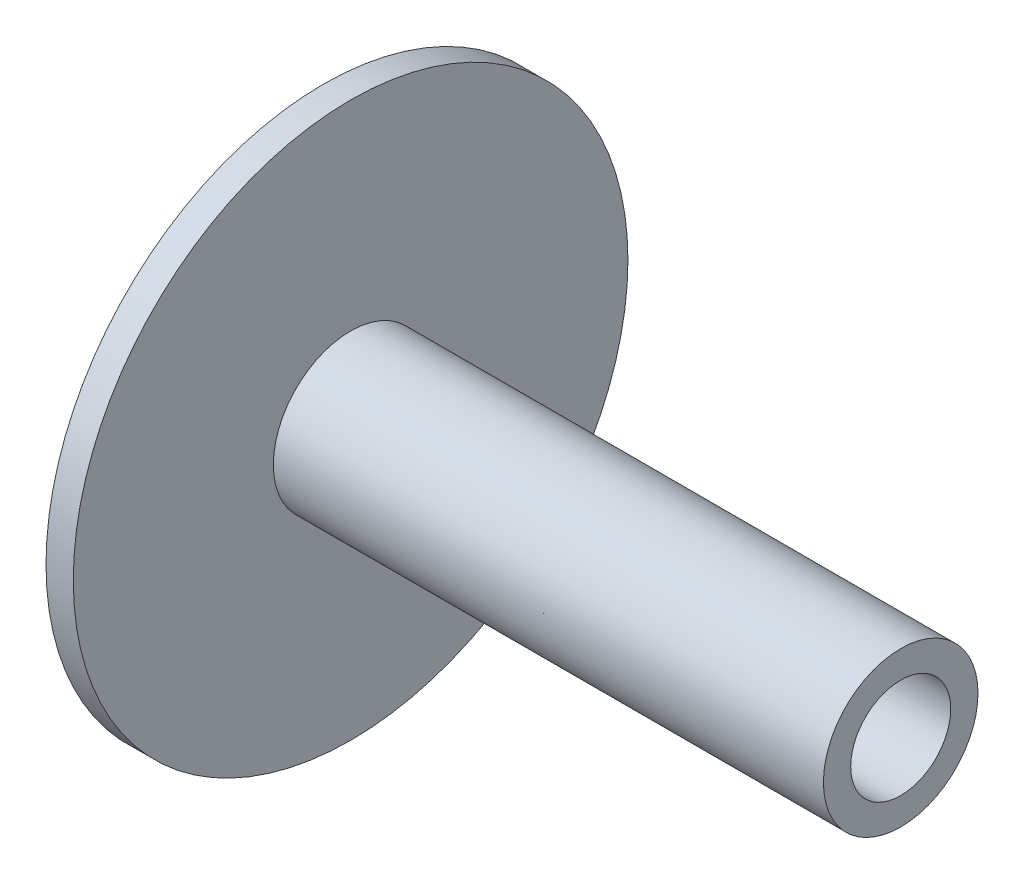
ISO-10303-21;
HEADER;
FILE_DESCRIPTION(('STEP AP214'),'2;1');
FILE_NAME('part.step','',(''),(''),'','','');
FILE_SCHEMA(('AUTOMOTIVE_DESIGN { 1 0 10303 214 1 1 1 1 }'));
ENDSEC;
DATA;
#1=APPLICATION_CONTEXT('core data for automotive mechanical design processes');
#2=APPLICATION_PROTOCOL_DEFINITION('international standard','automotive_design',2000,#1);
#3=PRODUCT_CONTEXT('',#1,'mechanical');
#4=PRODUCT('Part','Part','',(#3));
#5=PRODUCT_RELATED_PRODUCT_CATEGORY('part','',(#4));
#6=PRODUCT_DEFINITION_FORMATION('','',#4);
#7=PRODUCT_DEFINITION_CONTEXT('part definition',#1,'design');
#8=PRODUCT_DEFINITION('design','',#6,#7);
#9=PRODUCT_DEFINITION_SHAPE('','',#8);
#10=(LENGTH_UNIT() NAMED_UNIT(*) SI_UNIT(.MILLI.,.METRE.));
#11=(NAMED_UNIT(*) PLANE_ANGLE_UNIT() SI_UNIT($,.RADIAN.));
#12=(NAMED_UNIT(*) SI_UNIT($,.STERADIAN.) SOLID_ANGLE_UNIT());
#13=UNCERTAINTY_MEASURE_WITH_UNIT(LENGTH_MEASURE(1.E-05),#10,'distance_accuracy_value','');
#14=(GEOMETRIC_REPRESENTATION_CONTEXT(3) GLOBAL_UNCERTAINTY_ASSIGNED_CONTEXT((#13)) GLOBAL_UNIT_ASSIGNED_CONTEXT((#10,
#11,#12)) REPRESENTATION_CONTEXT('',''));
#15=CARTESIAN_POINT('',(0.,0.,0.));
#16=DIRECTION('',(0.,0.,1.));
#17=DIRECTION('',(1.,0.,0.));
#18=AXIS2_PLACEMENT_3D('',#15,#16,#17);
#19=CARTESIAN_POINT('',(24.2,0.,0.));
#20=DIRECTION('',(1.,0.,0.));
#21=DIRECTION('',(0.,0.,-1.));
#22=AXIS2_PLACEMENT_3D('',#19,#20,#21);
#23=PLANE('',#22);
#24=CARTESIAN_POINT('',(24.2,0.,0.));
#25=DIRECTION('',(1.,0.,0.));
#26=DIRECTION('',(0.,0.,-1.));
#27=AXIS2_PLACEMENT_3D('',#24,#25,#26);
#28=CIRCLE('',#27,3.4);
#29=CARTESIAN_POINT('',(24.2,0.,-3.4));
#30=VERTEX_POINT('',#29);
#31=EDGE_CURVE('E10',#30,#30,#28,.T.);
#32=ORIENTED_EDGE('',*,*,#31,.T.);
#33=EDGE_LOOP('',(#32));
#34=FACE_BOUND('',#33,.T.);
#35=CARTESIAN_POINT('',(24.2,0.,0.));
#36=DIRECTION('',(1.,0.,0.));
#37=DIRECTION('',(0.,0.,-1.));
#38=AXIS2_PLACEMENT_3D('',#35,#36,#37);
#39=CIRCLE('',#38,2.2);
#40=CARTESIAN_POINT('',(24.2,0.,-2.2));
#41=VERTEX_POINT('',#40);
#42=EDGE_CURVE('E38',#41,#41,#39,.T.);
#43=ORIENTED_EDGE('',*,*,#42,.F.);
#44=EDGE_LOOP('',(#43));
#45=FACE_BOUND('',#44,.T.);
#46=ADVANCED_FACE('F31',(#34,#45),#23,.T.);
#47=CARTESIAN_POINT('',(24.2,0.,0.));
#48=DIRECTION('',(-1.,0.,0.));
#49=DIRECTION('',(0.,0.,1.));
#50=AXIS2_PLACEMENT_3D('',#47,#48,#49);
#51=CYLINDRICAL_SURFACE('',#50,3.4);
#52=ORIENTED_EDGE('',*,*,#31,.F.);
#53=EDGE_LOOP('',(#52));
#54=FACE_BOUND('',#53,.T.);
#55=CARTESIAN_POINT('',(0.,0.,0.));
#56=DIRECTION('',(-1.,0.,0.));
#57=DIRECTION('',(0.,0.,1.));
#58=AXIS2_PLACEMENT_3D('',#55,#56,#57);
#59=CIRCLE('',#58,3.4);
#60=CARTESIAN_POINT('',(0.,0.,3.4));
#61=VERTEX_POINT('',#60);
#62=EDGE_CURVE('E42',#61,#61,#59,.T.);
#63=ORIENTED_EDGE('',*,*,#62,.F.);
#64=EDGE_LOOP('',(#63));
#65=FACE_BOUND('',#64,.T.);
#66=ADVANCED_FACE('F33',(#54,#65),#51,.T.);
#67=CARTESIAN_POINT('',(24.2,0.,0.));
#68=DIRECTION('',(-1.,0.,0.));
#69=DIRECTION('',(0.,0.,1.));
#70=AXIS2_PLACEMENT_3D('',#67,#68,#69);
#71=CYLINDRICAL_SURFACE('',#70,2.2);
#72=ORIENTED_EDGE('',*,*,#42,.T.);
#73=EDGE_LOOP('',(#72));
#74=FACE_BOUND('',#73,.T.);
#75=CARTESIAN_POINT('',(-1.2,0.,0.));
#76=DIRECTION('',(-1.,0.,0.));
#77=DIRECTION('',(0.,0.,1.));
#78=AXIS2_PLACEMENT_3D('',#75,#76,#77);
#79=CIRCLE('',#78,2.2);
#80=CARTESIAN_POINT('',(-1.2,0.,2.2));
#81=VERTEX_POINT('',#80);
#82=EDGE_CURVE('E52',#81,#81,#79,.T.);
#83=ORIENTED_EDGE('',*,*,#82,.T.);
#84=EDGE_LOOP('',(#83));
#85=FACE_BOUND('',#84,.T.);
#86=ADVANCED_FACE('F58',(#74,#85),#71,.F.);
#87=CARTESIAN_POINT('',(0.,0.,0.));
#88=DIRECTION('',(-1.,0.,0.));
#89=DIRECTION('',(0.,0.,1.));
#90=AXIS2_PLACEMENT_3D('',#87,#88,#89);
#91=PLANE('',#90);
#92=CARTESIAN_POINT('',(0.,0.,0.));
#93=DIRECTION('',(-1.,0.,0.));
#94=DIRECTION('',(0.,0.,1.));
#95=AXIS2_PLACEMENT_3D('',#92,#93,#94);
#96=CIRCLE('',#95,12.2);
#97=CARTESIAN_POINT('',(0.,0.,12.2));
#98=VERTEX_POINT('',#97);
#99=EDGE_CURVE('E49',#98,#98,#96,.T.);
#100=ORIENTED_EDGE('',*,*,#99,.F.);
#101=EDGE_LOOP('',(#100));
#102=FACE_BOUND('',#101,.T.);
#103=ORIENTED_EDGE('',*,*,#62,.T.);
#104=EDGE_LOOP('',(#103));
#105=FACE_BOUND('',#104,.T.);
#106=ADVANCED_FACE('F63',(#102,#105),#91,.F.);
#107=CARTESIAN_POINT('',(-1.2,0.,0.));
#108=DIRECTION('',(-1.,0.,0.));
#109=DIRECTION('',(0.,0.,1.));
#110=AXIS2_PLACEMENT_3D('',#107,#108,#109);
#111=PLANE('',#110);
#112=CARTESIAN_POINT('',(-1.2,0.,0.));
#113=DIRECTION('',(-1.,0.,0.));
#114=DIRECTION('',(0.,0.,1.));
#115=AXIS2_PLACEMENT_3D('',#112,#113,#114);
#116=CIRCLE('',#115,12.2);
#117=CARTESIAN_POINT('',(-1.2,0.,12.2));
#118=VERTEX_POINT('',#117);
#119=EDGE_CURVE('E46',#118,#118,#116,.T.);
#120=ORIENTED_EDGE('',*,*,#119,.T.);
#121=EDGE_LOOP('',(#120));
#122=FACE_BOUND('',#121,.T.);
#123=ORIENTED_EDGE('',*,*,#82,.F.);
#124=EDGE_LOOP('',(#123));
#125=FACE_BOUND('',#124,.T.);
#126=ADVANCED_FACE('F60',(#122,#125),#111,.T.);
#127=CARTESIAN_POINT('',(-1.2,0.,0.));
#128=DIRECTION('',(1.,0.,0.));
#129=DIRECTION('',(0.,0.,-1.));
#130=AXIS2_PLACEMENT_3D('',#127,#128,#129);
#131=CYLINDRICAL_SURFACE('',#130,12.2);
#132=ORIENTED_EDGE('',*,*,#119,.F.);
#133=EDGE_LOOP('',(#132));
#134=FACE_BOUND('',#133,.T.);
#135=ORIENTED_EDGE('',*,*,#99,.T.);
#136=EDGE_LOOP('',(#135));
#137=FACE_BOUND('',#136,.T.);
#138=ADVANCED_FACE('F62',(#134,#137),#131,.T.);
#139=CLOSED_SHELL('',(#46,#66,#86,#106,#126,#138));
#140=MANIFOLD_SOLID_BREP('B2',#139);
#141=ADVANCED_BREP_SHAPE_REPRESENTATION('',(#18,#140),#14);
#142=SHAPE_DEFINITION_REPRESENTATION(#9,#141);
ENDSEC;
END-ISO-10303-21;
